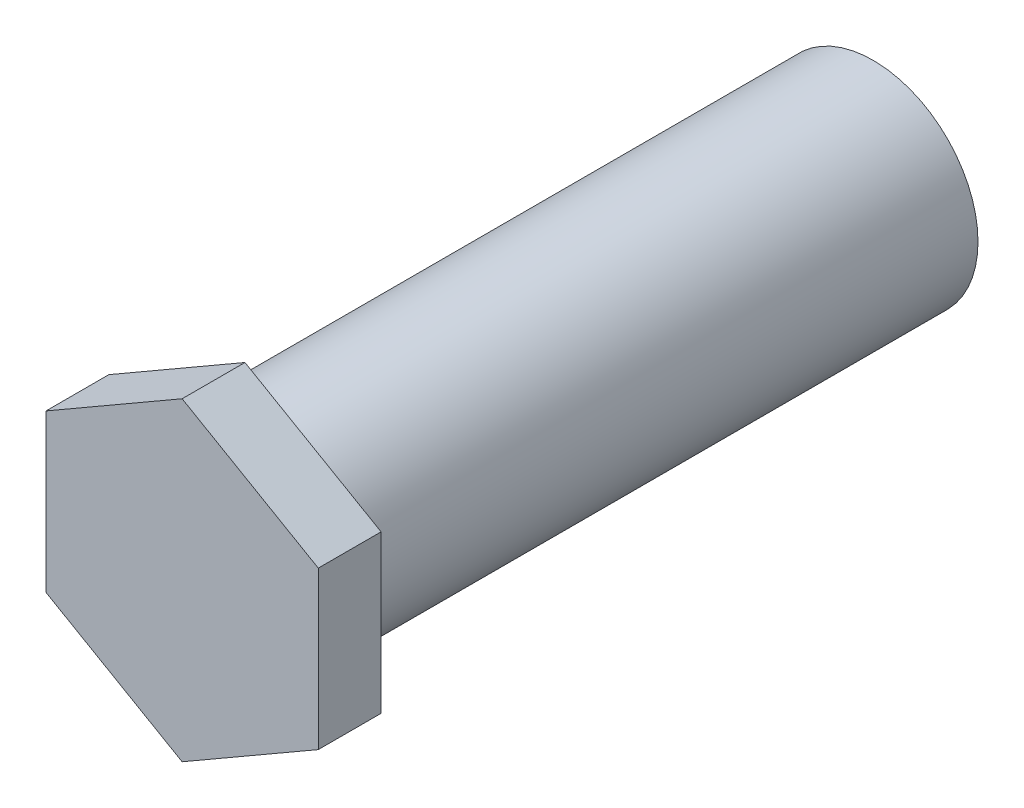
ISO-10303-21;
HEADER;
FILE_DESCRIPTION(('STEP AP214'),'2;1');
FILE_NAME('part.step','',(''),(''),'','','');
FILE_SCHEMA(('AUTOMOTIVE_DESIGN { 1 0 10303 214 1 1 1 1 }'));
ENDSEC;
DATA;
#1=APPLICATION_CONTEXT('core data for automotive mechanical design processes');
#2=APPLICATION_PROTOCOL_DEFINITION('international standard','automotive_design',2000,#1);
#3=PRODUCT_CONTEXT('',#1,'mechanical');
#4=PRODUCT('Part','Part','',(#3));
#5=PRODUCT_RELATED_PRODUCT_CATEGORY('part','',(#4));
#6=PRODUCT_DEFINITION_FORMATION('','',#4);
#7=PRODUCT_DEFINITION_CONTEXT('part definition',#1,'design');
#8=PRODUCT_DEFINITION('design','',#6,#7);
#9=PRODUCT_DEFINITION_SHAPE('','',#8);
#10=(LENGTH_UNIT() NAMED_UNIT(*) SI_UNIT(.MILLI.,.METRE.));
#11=(NAMED_UNIT(*) PLANE_ANGLE_UNIT() SI_UNIT($,.RADIAN.));
#12=(NAMED_UNIT(*) SI_UNIT($,.STERADIAN.) SOLID_ANGLE_UNIT());
#13=UNCERTAINTY_MEASURE_WITH_UNIT(LENGTH_MEASURE(1.E-05),#10,'distance_accuracy_value','');
#14=(GEOMETRIC_REPRESENTATION_CONTEXT(3) GLOBAL_UNCERTAINTY_ASSIGNED_CONTEXT((#13)) GLOBAL_UNIT_ASSIGNED_CONTEXT((#10,
#11,#12)) REPRESENTATION_CONTEXT('',''));
#15=CARTESIAN_POINT('',(0.,0.,0.));
#16=DIRECTION('',(0.,0.,1.));
#17=DIRECTION('',(1.,0.,0.));
#18=AXIS2_PLACEMENT_3D('',#15,#16,#17);
#19=CARTESIAN_POINT('',(0.,0.,-30.));
#20=DIRECTION('',(0.,0.,1.));
#21=DIRECTION('',(1.,0.,0.));
#22=AXIS2_PLACEMENT_3D('',#19,#20,#21);
#23=CYLINDRICAL_SURFACE('',#22,5.);
#24=CARTESIAN_POINT('',(0.,0.,-30.));
#25=DIRECTION('',(0.,0.,1.));
#26=DIRECTION('',(1.,0.,0.));
#27=AXIS2_PLACEMENT_3D('',#24,#25,#26);
#28=CIRCLE('',#27,5.);
#29=CARTESIAN_POINT('',(5.,0.,-30.));
#30=VERTEX_POINT('',#29);
#31=EDGE_CURVE('E11',#30,#30,#28,.T.);
#32=ORIENTED_EDGE('',*,*,#31,.T.);
#33=EDGE_LOOP('',(#32));
#34=FACE_BOUND('',#33,.T.);
#35=CARTESIAN_POINT('',(0.,0.,0.));
#36=DIRECTION('',(0.,0.,1.));
#37=DIRECTION('',(1.,0.,0.));
#38=AXIS2_PLACEMENT_3D('',#35,#36,#37);
#39=CIRCLE('',#38,5.);
#40=CARTESIAN_POINT('',(5.,0.,0.));
#41=VERTEX_POINT('',#40);
#42=EDGE_CURVE('E40',#41,#41,#39,.T.);
#43=ORIENTED_EDGE('',*,*,#42,.F.);
#44=EDGE_LOOP('',(#43));
#45=FACE_BOUND('',#44,.T.);
#46=ADVANCED_FACE('F37',(#34,#45),#23,.T.);
#47=CARTESIAN_POINT('',(0.,0.,-30.));
#48=DIRECTION('',(0.,0.,1.));
#49=DIRECTION('',(1.,0.,0.));
#50=AXIS2_PLACEMENT_3D('',#47,#48,#49);
#51=PLANE('',#50);
#52=ORIENTED_EDGE('',*,*,#31,.F.);
#53=EDGE_LOOP('',(#52));
#54=FACE_BOUND('',#53,.T.);
#55=ADVANCED_FACE('F148',(#54),#51,.F.);
#56=CARTESIAN_POINT('',(-6.5,3.75277674973257,3.));
#57=DIRECTION('',(1.,0.,0.));
#58=DIRECTION('',(0.,1.,0.));
#59=AXIS2_PLACEMENT_3D('',#56,#57,#58);
#60=PLANE('',#59);
#61=DIRECTION('',(0.,-1.,0.));
#62=VECTOR('',#61,1.);
#63=CARTESIAN_POINT('',(-6.5,3.75277674973257,0.));
#64=LINE('',#63,#62);
#65=CARTESIAN_POINT('',(-6.5,3.75277674973257,0.));
#66=VERTEX_POINT('',#65);
#67=CARTESIAN_POINT('',(-6.5,-3.75277674973256,0.));
#68=VERTEX_POINT('',#67);
#69=EDGE_CURVE('E122',#66,#68,#64,.T.);
#70=ORIENTED_EDGE('',*,*,#69,.T.);
#71=DIRECTION('',(0.,0.,-1.));
#72=VECTOR('',#71,1.);
#73=CARTESIAN_POINT('',(-6.5,-3.75277674973256,3.));
#74=LINE('',#73,#72);
#75=CARTESIAN_POINT('',(-6.5,-3.75277674973256,3.));
#76=VERTEX_POINT('',#75);
#77=EDGE_CURVE('E139',#76,#68,#74,.T.);
#78=ORIENTED_EDGE('',*,*,#77,.F.);
#79=DIRECTION('',(0.,-1.,0.));
#80=VECTOR('',#79,1.);
#81=CARTESIAN_POINT('',(-6.5,3.75277674973257,3.));
#82=LINE('',#81,#80);
#83=CARTESIAN_POINT('',(-6.5,3.75277674973257,3.));
#84=VERTEX_POINT('',#83);
#85=EDGE_CURVE('E132',#84,#76,#82,.T.);
#86=ORIENTED_EDGE('',*,*,#85,.F.);
#87=DIRECTION('',(0.,0.,-1.));
#88=VECTOR('',#87,1.);
#89=CARTESIAN_POINT('',(-6.5,3.75277674973257,3.));
#90=LINE('',#89,#88);
#91=EDGE_CURVE('E118',#84,#66,#90,.T.);
#92=ORIENTED_EDGE('',*,*,#91,.T.);
#93=EDGE_LOOP('',(#70,#78,#86,#92));
#94=FACE_BOUND('',#93,.T.);
#95=ADVANCED_FACE('F153',(#94),#60,.F.);
#96=CARTESIAN_POINT('',(-6.5,-3.75277674973256,3.));
#97=DIRECTION('',(0.5,0.866025403784438,0.));
#98=DIRECTION('',(-0.866025403784439,0.5,0.));
#99=AXIS2_PLACEMENT_3D('',#96,#97,#98);
#100=PLANE('',#99);
#101=DIRECTION('',(0.866025403784439,-0.5,0.));
#102=VECTOR('',#101,1.);
#103=CARTESIAN_POINT('',(-6.5,-3.75277674973256,0.));
#104=LINE('',#103,#102);
#105=CARTESIAN_POINT('',(0.,-7.50555349946513,0.));
#106=VERTEX_POINT('',#105);
#107=EDGE_CURVE('E125',#68,#106,#104,.T.);
#108=ORIENTED_EDGE('',*,*,#107,.T.);
#109=DIRECTION('',(0.,0.,-1.));
#110=VECTOR('',#109,1.);
#111=CARTESIAN_POINT('',(0.,-7.50555349946513,3.));
#112=LINE('',#111,#110);
#113=CARTESIAN_POINT('',(0.,-7.50555349946513,3.));
#114=VERTEX_POINT('',#113);
#115=EDGE_CURVE('E136',#114,#106,#112,.T.);
#116=ORIENTED_EDGE('',*,*,#115,.F.);
#117=DIRECTION('',(0.866025403784439,-0.5,0.));
#118=VECTOR('',#117,1.);
#119=CARTESIAN_POINT('',(-6.5,-3.75277674973256,3.));
#120=LINE('',#119,#118);
#121=EDGE_CURVE('E91',#76,#114,#120,.T.);
#122=ORIENTED_EDGE('',*,*,#121,.F.);
#123=ORIENTED_EDGE('',*,*,#77,.T.);
#124=EDGE_LOOP('',(#108,#116,#122,#123));
#125=FACE_BOUND('',#124,.T.);
#126=ADVANCED_FACE('F159',(#125),#100,.F.);
#127=CARTESIAN_POINT('',(0.,-7.50555349946513,3.));
#128=DIRECTION('',(-0.5,0.866025403784439,0.));
#129=DIRECTION('',(-0.866025403784439,-0.5,0.));
#130=AXIS2_PLACEMENT_3D('',#127,#128,#129);
#131=PLANE('',#130);
#132=DIRECTION('',(0.866025403784439,0.5,0.));
#133=VECTOR('',#132,1.);
#134=CARTESIAN_POINT('',(0.,-7.50555349946513,0.));
#135=LINE('',#134,#133);
#136=CARTESIAN_POINT('',(6.5,-3.75277674973257,0.));
#137=VERTEX_POINT('',#136);
#138=EDGE_CURVE('E127',#106,#137,#135,.T.);
#139=ORIENTED_EDGE('',*,*,#138,.T.);
#140=DIRECTION('',(0.,0.,-1.));
#141=VECTOR('',#140,1.);
#142=CARTESIAN_POINT('',(6.5,-3.75277674973257,3.));
#143=LINE('',#142,#141);
#144=CARTESIAN_POINT('',(6.5,-3.75277674973257,3.));
#145=VERTEX_POINT('',#144);
#146=EDGE_CURVE('E113',#145,#137,#143,.T.);
#147=ORIENTED_EDGE('',*,*,#146,.F.);
#148=DIRECTION('',(0.866025403784439,0.5,0.));
#149=VECTOR('',#148,1.);
#150=CARTESIAN_POINT('',(0.,-7.50555349946513,3.));
#151=LINE('',#150,#149);
#152=EDGE_CURVE('E104',#114,#145,#151,.T.);
#153=ORIENTED_EDGE('',*,*,#152,.F.);
#154=ORIENTED_EDGE('',*,*,#115,.T.);
#155=EDGE_LOOP('',(#139,#147,#153,#154));
#156=FACE_BOUND('',#155,.T.);
#157=ADVANCED_FACE('F165',(#156),#131,.F.);
#158=CARTESIAN_POINT('',(6.5,-3.75277674973257,3.));
#159=DIRECTION('',(-1.,0.,0.));
#160=DIRECTION('',(0.,0.,1.));
#161=AXIS2_PLACEMENT_3D('',#158,#159,#160);
#162=PLANE('',#161);
#163=DIRECTION('',(0.,1.,0.));
#164=VECTOR('',#163,1.);
#165=CARTESIAN_POINT('',(6.5,-3.75277674973257,0.));
#166=LINE('',#165,#164);
#167=CARTESIAN_POINT('',(6.5,3.75277674973257,0.));
#168=VERTEX_POINT('',#167);
#169=EDGE_CURVE('E112',#137,#168,#166,.T.);
#170=ORIENTED_EDGE('',*,*,#169,.T.);
#171=DIRECTION('',(0.,0.,-1.));
#172=VECTOR('',#171,1.);
#173=CARTESIAN_POINT('',(6.5,3.75277674973257,3.));
#174=LINE('',#173,#172);
#175=CARTESIAN_POINT('',(6.5,3.75277674973257,3.));
#176=VERTEX_POINT('',#175);
#177=EDGE_CURVE('E109',#176,#168,#174,.T.);
#178=ORIENTED_EDGE('',*,*,#177,.F.);
#179=DIRECTION('',(0.,1.,0.));
#180=VECTOR('',#179,1.);
#181=CARTESIAN_POINT('',(6.5,-3.75277674973257,3.));
#182=LINE('',#181,#180);
#183=EDGE_CURVE('E98',#145,#176,#182,.T.);
#184=ORIENTED_EDGE('',*,*,#183,.F.);
#185=ORIENTED_EDGE('',*,*,#146,.T.);
#186=EDGE_LOOP('',(#170,#178,#184,#185));
#187=FACE_BOUND('',#186,.T.);
#188=ADVANCED_FACE('F110',(#187),#162,.F.);
#189=CARTESIAN_POINT('',(6.5,3.75277674973257,3.));
#190=DIRECTION('',(-0.5,-0.866025403784438,0.));
#191=DIRECTION('',(0.866025403784439,-0.5,0.));
#192=AXIS2_PLACEMENT_3D('',#189,#190,#191);
#193=PLANE('',#192);
#194=DIRECTION('',(-0.866025403784439,0.5,0.));
#195=VECTOR('',#194,1.);
#196=CARTESIAN_POINT('',(6.5,3.75277674973257,0.));
#197=LINE('',#196,#195);
#198=CARTESIAN_POINT('',(0.,7.50555349946513,0.));
#199=VERTEX_POINT('',#198);
#200=EDGE_CURVE('E76',#168,#199,#197,.T.);
#201=ORIENTED_EDGE('',*,*,#200,.T.);
#202=DIRECTION('',(0.,0.,-1.));
#203=VECTOR('',#202,1.);
#204=CARTESIAN_POINT('',(0.,7.50555349946513,3.));
#205=LINE('',#204,#203);
#206=CARTESIAN_POINT('',(0.,7.50555349946513,3.));
#207=VERTEX_POINT('',#206);
#208=EDGE_CURVE('E114',#207,#199,#205,.T.);
#209=ORIENTED_EDGE('',*,*,#208,.F.);
#210=DIRECTION('',(-0.866025403784439,0.5,0.));
#211=VECTOR('',#210,1.);
#212=CARTESIAN_POINT('',(6.5,3.75277674973257,3.));
#213=LINE('',#212,#211);
#214=EDGE_CURVE('E102',#176,#207,#213,.T.);
#215=ORIENTED_EDGE('',*,*,#214,.F.);
#216=ORIENTED_EDGE('',*,*,#177,.T.);
#217=EDGE_LOOP('',(#201,#209,#215,#216));
#218=FACE_BOUND('',#217,.T.);
#219=ADVANCED_FACE('F116',(#218),#193,.F.);
#220=CARTESIAN_POINT('',(0.,7.50555349946513,3.));
#221=DIRECTION('',(0.5,-0.866025403784439,0.));
#222=DIRECTION('',(0.866025403784439,0.5,0.));
#223=AXIS2_PLACEMENT_3D('',#220,#221,#222);
#224=PLANE('',#223);
#225=DIRECTION('',(-0.866025403784439,-0.5,0.));
#226=VECTOR('',#225,1.);
#227=CARTESIAN_POINT('',(0.,7.50555349946513,0.));
#228=LINE('',#227,#226);
#229=EDGE_CURVE('E82',#199,#66,#228,.T.);
#230=ORIENTED_EDGE('',*,*,#229,.T.);
#231=ORIENTED_EDGE('',*,*,#91,.F.);
#232=DIRECTION('',(-0.866025403784439,-0.5,0.));
#233=VECTOR('',#232,1.);
#234=CARTESIAN_POINT('',(0.,7.50555349946513,3.));
#235=LINE('',#234,#233);
#236=EDGE_CURVE('E53',#207,#84,#235,.T.);
#237=ORIENTED_EDGE('',*,*,#236,.F.);
#238=ORIENTED_EDGE('',*,*,#208,.T.);
#239=EDGE_LOOP('',(#230,#231,#237,#238));
#240=FACE_BOUND('',#239,.T.);
#241=ADVANCED_FACE('F173',(#240),#224,.F.);
#242=CARTESIAN_POINT('',(0.,0.,3.));
#243=DIRECTION('',(0.,0.,1.));
#244=DIRECTION('',(1.,0.,0.));
#245=AXIS2_PLACEMENT_3D('',#242,#243,#244);
#246=PLANE('',#245);
#247=ORIENTED_EDGE('',*,*,#85,.T.);
#248=ORIENTED_EDGE('',*,*,#121,.T.);
#249=ORIENTED_EDGE('',*,*,#152,.T.);
#250=ORIENTED_EDGE('',*,*,#183,.T.);
#251=ORIENTED_EDGE('',*,*,#214,.T.);
#252=ORIENTED_EDGE('',*,*,#236,.T.);
#253=EDGE_LOOP('',(#247,#248,#249,#250,#251,#252));
#254=FACE_BOUND('',#253,.T.);
#255=ADVANCED_FACE('F100',(#254),#246,.T.);
#256=CARTESIAN_POINT('',(0.,0.,0.));
#257=DIRECTION('',(0.,0.,1.));
#258=DIRECTION('',(1.,0.,0.));
#259=AXIS2_PLACEMENT_3D('',#256,#257,#258);
#260=PLANE('',#259);
#261=ORIENTED_EDGE('',*,*,#42,.T.);
#262=EDGE_LOOP('',(#261));
#263=FACE_BOUND('',#262,.T.);
#264=ORIENTED_EDGE('',*,*,#69,.F.);
#265=ORIENTED_EDGE('',*,*,#229,.F.);
#266=ORIENTED_EDGE('',*,*,#200,.F.);
#267=ORIENTED_EDGE('',*,*,#169,.F.);
#268=ORIENTED_EDGE('',*,*,#138,.F.);
#269=ORIENTED_EDGE('',*,*,#107,.F.);
#270=EDGE_LOOP('',(#264,#265,#266,#267,#268,#269));
#271=FACE_BOUND('',#270,.T.);
#272=ADVANCED_FACE('F144',(#263,#271),#260,.F.);
#273=CLOSED_SHELL('',(#46,#55,#95,#126,#157,#188,#219,#241,#255,#272));
#274=MANIFOLD_SOLID_BREP('B2',#273);
#275=ADVANCED_BREP_SHAPE_REPRESENTATION('',(#18,#274),#14);
#276=SHAPE_DEFINITION_REPRESENTATION(#9,#275);
ENDSEC;
END-ISO-10303-21;
